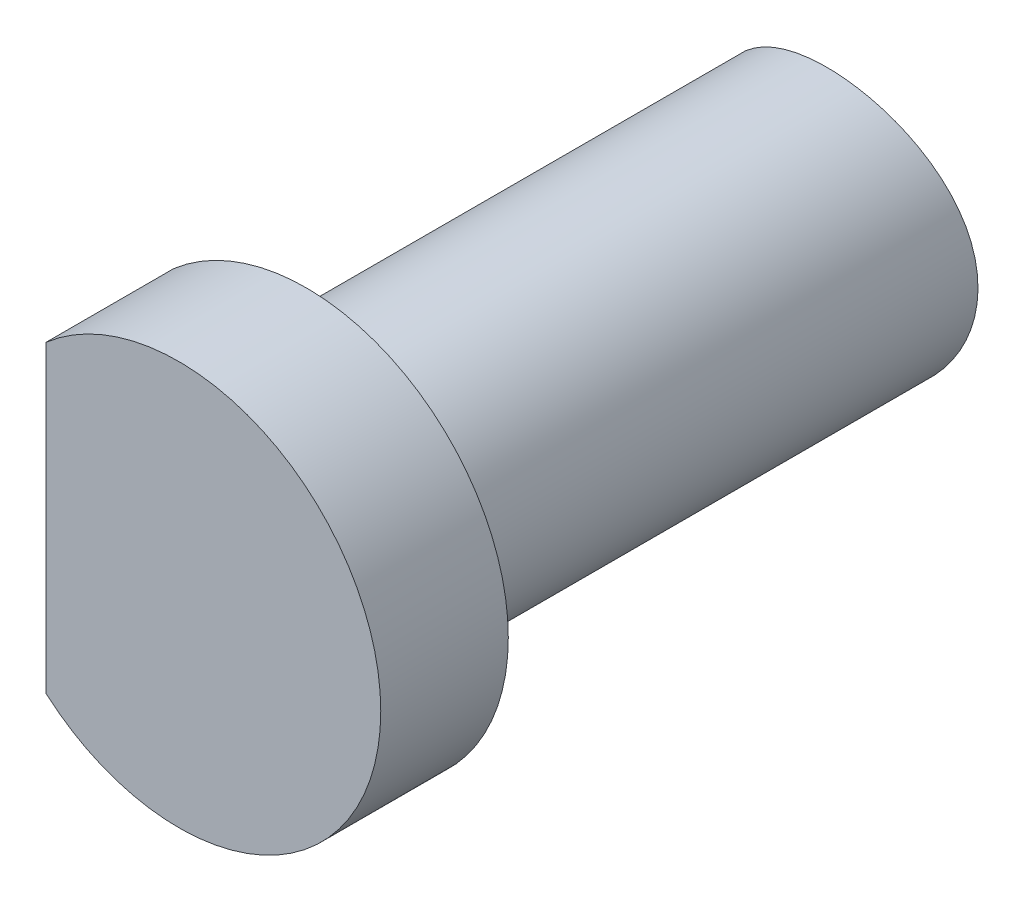
ISO-10303-21;
HEADER;
FILE_DESCRIPTION(('STEP AP214'),'2;1');
FILE_NAME('part.step','',(''),(''),'','','');
FILE_SCHEMA(('AUTOMOTIVE_DESIGN { 1 0 10303 214 1 1 1 1 }'));
ENDSEC;
DATA;
#1=APPLICATION_CONTEXT('core data for automotive mechanical design processes');
#2=APPLICATION_PROTOCOL_DEFINITION('international standard','automotive_design',2000,#1);
#3=PRODUCT_CONTEXT('',#1,'mechanical');
#4=PRODUCT('Part','Part','',(#3));
#5=PRODUCT_RELATED_PRODUCT_CATEGORY('part','',(#4));
#6=PRODUCT_DEFINITION_FORMATION('','',#4);
#7=PRODUCT_DEFINITION_CONTEXT('part definition',#1,'design');
#8=PRODUCT_DEFINITION('design','',#6,#7);
#9=PRODUCT_DEFINITION_SHAPE('','',#8);
#10=(LENGTH_UNIT() NAMED_UNIT(*) SI_UNIT(.MILLI.,.METRE.));
#11=(NAMED_UNIT(*) PLANE_ANGLE_UNIT() SI_UNIT($,.RADIAN.));
#12=(NAMED_UNIT(*) SI_UNIT($,.STERADIAN.) SOLID_ANGLE_UNIT());
#13=UNCERTAINTY_MEASURE_WITH_UNIT(LENGTH_MEASURE(1.E-05),#10,'distance_accuracy_value','');
#14=(GEOMETRIC_REPRESENTATION_CONTEXT(3) GLOBAL_UNCERTAINTY_ASSIGNED_CONTEXT((#13)) GLOBAL_UNIT_ASSIGNED_CONTEXT((#10,
#11,#12)) REPRESENTATION_CONTEXT('',''));
#15=CARTESIAN_POINT('',(0.,0.,0.));
#16=DIRECTION('',(0.,0.,1.));
#17=DIRECTION('',(1.,0.,0.));
#18=AXIS2_PLACEMENT_3D('',#15,#16,#17);
#19=CARTESIAN_POINT('',(0.,-20.,67.6776695296637));
#20=DIRECTION('',(0.,0.,-1.));
#21=DIRECTION('',(-1.,0.,0.));
#22=AXIS2_PLACEMENT_3D('',#19,#20,#21);
#23=CYLINDRICAL_SURFACE('',#22,6.25);
#24=CARTESIAN_POINT('',(-4.54610268743353,-24.2889917644255,18.9944467153757));
#25=CARTESIAN_POINT('',(-4.30571027713354,-24.5437836211791,19.0373798327798));
#26=CARTESIAN_POINT('',(-4.04382815717836,-24.7783678659282,19.080827075093));
#27=CARTESIAN_POINT('',(-3.4839747672042,-25.2007194275226,19.1637784309609));
#28=CARTESIAN_POINT('',(-3.1859852371516,-25.3884629082816,19.2032805308254));
#29=CARTESIAN_POINT('',(-2.56164970472477,-25.7117484666868,19.2738683921156));
#30=CARTESIAN_POINT('',(-2.23528247896117,-25.8472510551319,19.3049477815135));
#31=CARTESIAN_POINT('',(-1.56359171486019,-26.0615085312326,19.355068007766));
#32=CARTESIAN_POINT('',(-1.21827333743835,-26.1402787869302,19.3741121046515));
#33=CARTESIAN_POINT('',(-0.525290504036039,-26.237525044197,19.3977330410675));
#34=CARTESIAN_POINT('',(-0.177787760984687,-26.2570900055232,19.4025711209886));
#35=CARTESIAN_POINT('',(0.515544582535132,-26.2383459745155,19.3979765002646));
#36=CARTESIAN_POINT('',(0.861374278298481,-26.2000403183072,19.3885446222541));
#37=CARTESIAN_POINT('',(1.53628999070199,-26.0678539943691,19.3567198331985));
#38=CARTESIAN_POINT('',(1.86554723096663,-25.9747970232268,19.3345191294276));
#39=CARTESIAN_POINT('',(2.50376048785746,-25.73669946802,19.2797215228829));
#40=CARTESIAN_POINT('',(2.81271456646525,-25.5916539299421,19.2471236293889));
#41=CARTESIAN_POINT('',(3.40738023403432,-25.2508759601815,19.17440340442));
#42=CARTESIAN_POINT('',(3.69260636774636,-25.0543223528922,19.1341623796609));
#43=CARTESIAN_POINT('',(4.22656136058962,-24.6171192409603,19.0509504499884));
#44=CARTESIAN_POINT('',(4.47528402877182,-24.3764622719617,19.0079790837787));
#45=CARTESIAN_POINT('',(4.93520343751962,-23.8511005757204,18.9231014020035));
#46=CARTESIAN_POINT('',(5.14537843677562,-23.5654919505422,18.8812440043913));
#47=CARTESIAN_POINT('',(5.51481826049085,-22.9621574256467,18.8047463044709));
#48=CARTESIAN_POINT('',(5.67408590582979,-22.6444333067987,18.7701056023079));
#49=CARTESIAN_POINT('',(5.93583219554039,-21.988039973106,18.7126888322626));
#50=CARTESIAN_POINT('',(6.03871513515139,-21.6495397546227,18.6898283691833));
#51=CARTESIAN_POINT('',(6.18598661445342,-20.9594192638098,18.6587284680961));
#52=CARTESIAN_POINT('',(6.23038835105863,-20.6078019699126,18.6504857312951));
#53=CARTESIAN_POINT('',(6.25878493207778,-19.9124431536791,18.649965825829));
#54=CARTESIAN_POINT('',(6.24450482385904,-19.5687712483624,18.6572297518435));
#55=CARTESIAN_POINT('',(6.15999412567776,-18.8890206557848,18.6861773330686));
#56=CARTESIAN_POINT('',(6.08976385591997,-18.5529419250792,18.7078609057549));
#57=CARTESIAN_POINT('',(5.8961327451131,-17.8990608507907,18.7632235333806));
#58=CARTESIAN_POINT('',(5.77294839243698,-17.5811900016428,18.796853651947));
#59=CARTESIAN_POINT('',(5.47716873377342,-16.9704281595178,18.8725774342309));
#60=CARTESIAN_POINT('',(5.30456516788141,-16.6775413529923,18.9146725124275));
#61=CARTESIAN_POINT('',(4.90899374770098,-16.1159817906764,19.0042961372713));
#62=CARTESIAN_POINT('',(4.68471959712789,-15.8482482840813,19.0519461757138));
#63=CARTESIAN_POINT('',(4.19471008765028,-15.3536991768967,19.1466485414551));
#64=CARTESIAN_POINT('',(3.92896931159929,-15.1268889308287,19.1937007897897));
#65=CARTESIAN_POINT('',(3.35770488416704,-14.7166147707858,19.2831185180996));
#66=CARTESIAN_POINT('',(3.05155203792157,-14.534003219288,19.3253845595186));
#67=CARTESIAN_POINT('',(2.4116585693766,-14.2230732341213,19.3996385462846));
#68=CARTESIAN_POINT('',(2.07792190253722,-14.0947470321419,19.4316279620734));
#69=CARTESIAN_POINT('',(1.39910390299165,-13.8985740235462,19.481306708711));
#70=CARTESIAN_POINT('',(1.05436606707025,-13.8296072351028,19.4992602401056));
#71=CARTESIAN_POINT('',(0.357781374063628,-13.7504153244121,19.5199207030678));
#72=CARTESIAN_POINT('',(0.00593581595823765,-13.740179564447,19.5226303956896));
#73=CARTESIAN_POINT('',(-0.684859977135146,-13.7782681394309,19.5126514815516));
#74=CARTESIAN_POINT('',(-1.02390348441483,-13.8250341965362,19.5003726088687));
#75=CARTESIAN_POINT('',(-1.68911113203412,-13.9729351654131,19.4623842373624));
#76=CARTESIAN_POINT('',(-2.01527495194909,-14.0740714289089,19.4366744046258));
#77=CARTESIAN_POINT('',(-2.64737870100044,-14.3280984462829,19.3743017055551));
#78=CARTESIAN_POINT('',(-2.95321824536134,-14.4812261223455,19.3375887902103));
#79=CARTESIAN_POINT('',(-3.53524082206105,-14.8346782702926,19.2569427126769));
#80=CARTESIAN_POINT('',(-3.81141857244299,-15.0350111279139,19.2130082680438));
#81=CARTESIAN_POINT('',(-4.33490544203453,-15.484086820289,19.1209376243107));
#82=CARTESIAN_POINT('',(-4.58112967421778,-15.7340776621282,19.0727159611073));
#83=CARTESIAN_POINT('',(-5.0285514564104,-16.2719228025144,18.978299974628));
#84=CARTESIAN_POINT('',(-5.22974412004354,-16.5597812046953,18.9321058717996));
#85=CARTESIAN_POINT('',(-5.58372927336395,-17.1697473887133,18.8461789651795));
#86=CARTESIAN_POINT('',(-5.73588118530437,-17.4922404033717,18.8065347355823));
#87=CARTESIAN_POINT('',(-5.98343298953842,-18.1594639193315,18.7389602127845));
#88=CARTESIAN_POINT('',(-6.07884504714102,-18.5041896362483,18.7110274089747));
#89=CARTESIAN_POINT('',(-6.2080009699863,-19.1972261414083,18.6706117384031));
#90=CARTESIAN_POINT('',(-6.2431823572988,-19.5452479200565,18.6577710874684));
#91=CARTESIAN_POINT('',(-6.25501582238903,-20.2425204475186,18.6476484229594));
#92=CARTESIAN_POINT('',(-6.23167126101174,-20.5917711246132,18.650365515995));
#93=CARTESIAN_POINT('',(-6.12847426783097,-21.272864792239,18.6704816581572));
#94=CARTESIAN_POINT('',(-6.04996931195683,-21.6049240996641,18.6875324714718));
#95=CARTESIAN_POINT('',(-5.84043143731837,-22.251028448978,18.7335925891815));
#96=CARTESIAN_POINT('',(-5.70941718633118,-22.5650798476185,18.7625976437831));
#97=CARTESIAN_POINT('',(-5.42019161967904,-23.1256095677484,18.8244643120485));
#98=CARTESIAN_POINT('',(-5.26819232787316,-23.375443007125,18.8562481255573));
#99=CARTESIAN_POINT('',(-4.93112025693077,-23.8511760363962,18.923384764572));
#100=CARTESIAN_POINT('',(-4.74604450998245,-24.0770734757142,18.9587379102151));
#101=CARTESIAN_POINT('',(-4.54610268743353,-24.2889917644255,18.9944467153757));
#102=B_SPLINE_CURVE_WITH_KNOTS('',3,(#24,#25,#26,#27,#28,#29,#30,#31,#32,#33,#34,#35,#36,#37,
#38,#39,#40,#41,#42,#43,#44,#45,#46,#47,#48,#49,#50,#51,#52,#53,#54,#55,#56,#57,#58,#59,#60,#61,
#62,#63,#64,#65,#66,#67,#68,#69,#70,#71,#72,#73,#74,#75,#76,#77,#78,#79,#80,#81,#82,#83,#84,#85,
#86,#87,#88,#89,#90,#91,#92,#93,#94,#95,#96,#97,#98,#99,#100,#101),.UNSPECIFIED.,.T.,.F.,(4,2,2,
2,2,2,2,2,2,2,2,2,2,2,2,2,2,2,2,2,2,2,2,2,2,2,2,2,2,2,2,2,2,2,2,2,2,2,4),(0.,1.05771919691098,
2.11597554769366,3.17503027961343,4.23379801954092,5.27296978827189,6.31208165311139,
7.3359466780632,8.35990929351413,9.4013109782064,10.4428890799231,11.5089976891408,
12.5750472128732,13.6333493558754,14.6914126406448,15.7185983243913,16.7457781295601,
17.7687979404817,18.7919888383791,19.844621541807,20.8973918751189,21.9690843165639,
23.0406233453782,24.0914714481218,25.1421292089134,26.1646978188343,27.1872918525104,
28.2146097702297,29.2421103230063,30.299760881982,31.3575261510582,32.4285954071323,
33.4994349377208,34.5443408379155,35.5891867358992,36.6093581618379,37.6291672240507,
38.5088261136915,39.3885639711032),.UNSPECIFIED.);
#103=CARTESIAN_POINT('',(-4.54610268743353,-24.2889917644255,18.9944467153757));
#104=VERTEX_POINT('',#103);
#105=EDGE_CURVE('E24',#104,#104,#102,.T.);
#106=ORIENTED_EDGE('',*,*,#105,.T.);
#107=EDGE_LOOP('',(#106));
#108=FACE_BOUND('',#107,.T.);
#109=CARTESIAN_POINT('',(0.,-20.,44.));
#110=DIRECTION('',(0.,0.,1.));
#111=DIRECTION('',(0.,-1.,0.));
#112=AXIS2_PLACEMENT_3D('',#109,#110,#111);
#113=CIRCLE('',#112,6.25);
#114=CARTESIAN_POINT('',(-6.25,-20.,44.));
#115=VERTEX_POINT('',#114);
#116=EDGE_CURVE('E11',#115,#115,#113,.T.);
#117=ORIENTED_EDGE('',*,*,#116,.F.);
#118=EDGE_LOOP('',(#117));
#119=FACE_BOUND('',#118,.T.);
#120=ADVANCED_FACE('F17',(#108,#119),#23,.T.);
#121=CARTESIAN_POINT('',(0.,-19.1150011407836,0.));
#122=DIRECTION('',(0.,1.,0.));
#123=DIRECTION('',(-1.,0.,0.));
#124=AXIS2_PLACEMENT_3D('',#121,#122,#123);
#125=DEGENERATE_TOROIDAL_SURFACE('',#124,73.3250627430978,93.,.F.);
#126=ORIENTED_EDGE('',*,*,#105,.F.);
#127=EDGE_LOOP('',(#126));
#128=FACE_BOUND('',#127,.T.);
#129=ADVANCED_FACE('F75',(#128),#125,.T.);
#130=CARTESIAN_POINT('',(-6.25,-12.8454559893729,19.3208083600779));
#131=DIRECTION('',(-1.,0.,0.));
#132=DIRECTION('',(0.,-1.,0.));
#133=AXIS2_PLACEMENT_3D('',#130,#131,#132);
#134=PLANE('',#133);
#135=DIRECTION('',(0.,1.,0.));
#136=VECTOR('',#135,1.);
#137=CARTESIAN_POINT('',(-6.25,-12.8454559893729,44.));
#138=LINE('',#137,#136);
#139=CARTESIAN_POINT('',(-6.25,-12.8454559893729,44.));
#140=VERTEX_POINT('',#139);
#141=EDGE_CURVE('E33',#115,#140,#138,.T.);
#142=ORIENTED_EDGE('',*,*,#141,.F.);
#143=CARTESIAN_POINT('',(-6.25,-27.1545440106271,44.));
#144=VERTEX_POINT('',#143);
#145=EDGE_CURVE('E66',#144,#115,#138,.T.);
#146=ORIENTED_EDGE('',*,*,#145,.F.);
#147=DIRECTION('',(0.,0.,1.));
#148=VECTOR('',#147,1.);
#149=CARTESIAN_POINT('',(-6.25,-27.1545440106271,19.3208083600779));
#150=LINE('',#149,#148);
#151=CARTESIAN_POINT('',(-6.25,-27.1545440106271,50.));
#152=VERTEX_POINT('',#151);
#153=EDGE_CURVE('E53',#144,#152,#150,.T.);
#154=ORIENTED_EDGE('',*,*,#153,.T.);
#155=DIRECTION('',(0.,-1.,0.));
#156=VECTOR('',#155,1.);
#157=CARTESIAN_POINT('',(-6.25,-12.8454559893729,50.));
#158=LINE('',#157,#156);
#159=CARTESIAN_POINT('',(-6.25,-12.8454559893729,50.));
#160=VERTEX_POINT('',#159);
#161=EDGE_CURVE('E54',#160,#152,#158,.T.);
#162=ORIENTED_EDGE('',*,*,#161,.F.);
#163=DIRECTION('',(0.,0.,1.));
#164=VECTOR('',#163,1.);
#165=CARTESIAN_POINT('',(-6.25,-12.8454559893729,19.3208083600779));
#166=LINE('',#165,#164);
#167=EDGE_CURVE('E45',#140,#160,#166,.T.);
#168=ORIENTED_EDGE('',*,*,#167,.F.);
#169=EDGE_LOOP('',(#142,#146,#154,#162,#168));
#170=FACE_BOUND('',#169,.T.);
#171=ADVANCED_FACE('F60',(#170),#134,.T.);
#172=CARTESIAN_POINT('',(0.,-20.,19.3208083600779));
#173=DIRECTION('',(0.,0.,1.));
#174=DIRECTION('',(1.,0.,0.));
#175=AXIS2_PLACEMENT_3D('',#172,#173,#174);
#176=CYLINDRICAL_SURFACE('',#175,9.5);
#177=CARTESIAN_POINT('',(0.,-20.,44.));
#178=DIRECTION('',(0.,0.,1.));
#179=DIRECTION('',(0.,-1.,0.));
#180=AXIS2_PLACEMENT_3D('',#177,#178,#179);
#181=CIRCLE('',#180,9.5);
#182=EDGE_CURVE('E50',#140,#144,#181,.F.);
#183=ORIENTED_EDGE('',*,*,#182,.F.);
#184=ORIENTED_EDGE('',*,*,#167,.T.);
#185=CARTESIAN_POINT('',(0.,-20.,50.));
#186=DIRECTION('',(0.,0.,1.));
#187=DIRECTION('',(1.,0.,0.));
#188=AXIS2_PLACEMENT_3D('',#185,#186,#187);
#189=CIRCLE('',#188,9.5);
#190=EDGE_CURVE('E49',#152,#160,#189,.T.);
#191=ORIENTED_EDGE('',*,*,#190,.F.);
#192=ORIENTED_EDGE('',*,*,#153,.F.);
#193=EDGE_LOOP('',(#183,#184,#191,#192));
#194=FACE_BOUND('',#193,.T.);
#195=ADVANCED_FACE('F47',(#194),#176,.T.);
#196=CARTESIAN_POINT('',(0.,-20.,44.));
#197=DIRECTION('',(0.,0.,1.));
#198=DIRECTION('',(0.,-1.,0.));
#199=AXIS2_PLACEMENT_3D('',#196,#197,#198);
#200=PLANE('',#199);
#201=ORIENTED_EDGE('',*,*,#145,.T.);
#202=ORIENTED_EDGE('',*,*,#116,.T.);
#203=ORIENTED_EDGE('',*,*,#141,.T.);
#204=ORIENTED_EDGE('',*,*,#182,.T.);
#205=EDGE_LOOP('',(#201,#202,#203,#204));
#206=FACE_BOUND('',#205,.T.);
#207=ADVANCED_FACE('F82',(#206),#200,.F.);
#208=CARTESIAN_POINT('',(50.,75.,50.));
#209=DIRECTION('',(0.,0.,-1.));
#210=DIRECTION('',(0.,1.,0.));
#211=AXIS2_PLACEMENT_3D('',#208,#209,#210);
#212=PLANE('',#211);
#213=ORIENTED_EDGE('',*,*,#161,.T.);
#214=ORIENTED_EDGE('',*,*,#190,.T.);
#215=EDGE_LOOP('',(#213,#214));
#216=FACE_BOUND('',#215,.T.);
#217=ADVANCED_FACE('F57',(#216),#212,.F.);
#218=CLOSED_SHELL('',(#120,#129,#171,#195,#207,#217));
#219=MANIFOLD_SOLID_BREP('B1',#218);
#220=ADVANCED_BREP_SHAPE_REPRESENTATION('',(#18,#219),#14);
#221=SHAPE_DEFINITION_REPRESENTATION(#9,#220);
ENDSEC;
END-ISO-10303-21;
